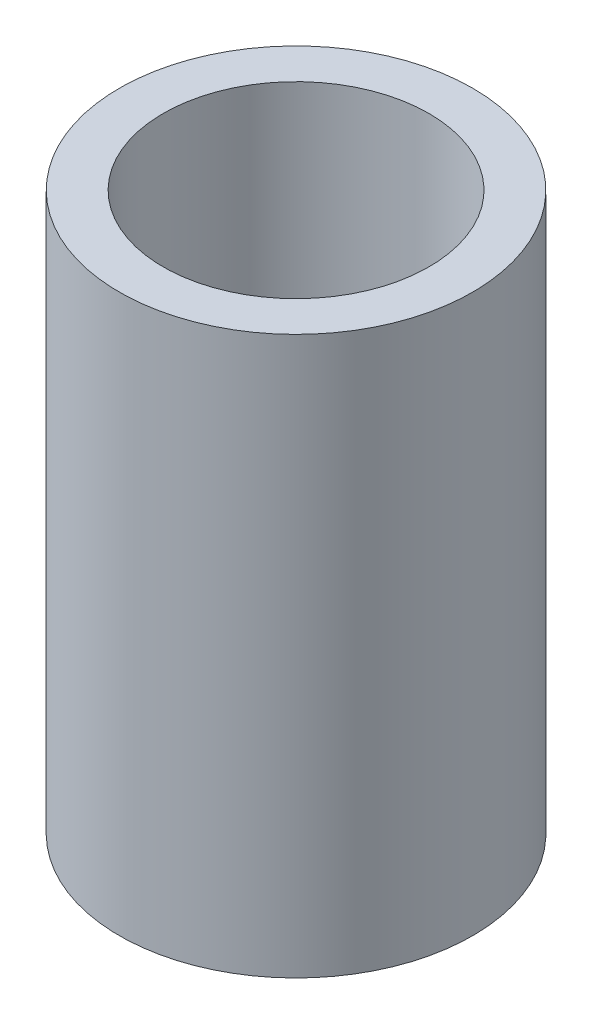
ISO-10303-21;
HEADER;
FILE_DESCRIPTION(('STEP AP214'),'2;1');
FILE_NAME('part.step','',(''),(''),'','','');
FILE_SCHEMA(('AUTOMOTIVE_DESIGN { 1 0 10303 214 1 1 1 1 }'));
ENDSEC;
DATA;
#1=APPLICATION_CONTEXT('core data for automotive mechanical design processes');
#2=APPLICATION_PROTOCOL_DEFINITION('international standard','automotive_design',2000,#1);
#3=PRODUCT_CONTEXT('',#1,'mechanical');
#4=PRODUCT('Part','Part','',(#3));
#5=PRODUCT_RELATED_PRODUCT_CATEGORY('part','',(#4));
#6=PRODUCT_DEFINITION_FORMATION('','',#4);
#7=PRODUCT_DEFINITION_CONTEXT('part definition',#1,'design');
#8=PRODUCT_DEFINITION('design','',#6,#7);
#9=PRODUCT_DEFINITION_SHAPE('','',#8);
#10=(LENGTH_UNIT() NAMED_UNIT(*) SI_UNIT(.MILLI.,.METRE.));
#11=(NAMED_UNIT(*) PLANE_ANGLE_UNIT() SI_UNIT($,.RADIAN.));
#12=(NAMED_UNIT(*) SI_UNIT($,.STERADIAN.) SOLID_ANGLE_UNIT());
#13=UNCERTAINTY_MEASURE_WITH_UNIT(LENGTH_MEASURE(1.E-05),#10,'distance_accuracy_value','');
#14=(GEOMETRIC_REPRESENTATION_CONTEXT(3) GLOBAL_UNCERTAINTY_ASSIGNED_CONTEXT((#13)) GLOBAL_UNIT_ASSIGNED_CONTEXT((#10,
#11,#12)) REPRESENTATION_CONTEXT('',''));
#15=CARTESIAN_POINT('',(0.,0.,0.));
#16=DIRECTION('',(0.,0.,1.));
#17=DIRECTION('',(1.,0.,0.));
#18=AXIS2_PLACEMENT_3D('',#15,#16,#17);
#19=CARTESIAN_POINT('',(0.,121.92,0.));
#20=DIRECTION('',(0.,-1.,0.));
#21=DIRECTION('',(0.,0.,-1.));
#22=AXIS2_PLACEMENT_3D('',#19,#20,#21);
#23=CYLINDRICAL_SURFACE('',#22,52.323742116433);
#24=CARTESIAN_POINT('',(0.,121.92,0.));
#25=DIRECTION('',(0.,1.,0.));
#26=DIRECTION('',(0.,0.,1.));
#27=AXIS2_PLACEMENT_3D('',#24,#25,#26);
#28=CIRCLE('',#27,52.323742116433);
#29=CARTESIAN_POINT('',(0.,121.92,-52.323742116433));
#30=VERTEX_POINT('',#29);
#31=EDGE_CURVE('E10',#30,#30,#28,.T.);
#32=CARTESIAN_POINT('',(0.,-43.18,0.));
#33=DIRECTION('',(0.,1.,0.));
#34=DIRECTION('',(0.,0.,1.));
#35=AXIS2_PLACEMENT_3D('',#32,#33,#34);
#36=CIRCLE('',#35,52.323742116433);
#37=CARTESIAN_POINT('',(0.,-43.18,-52.323742116433));
#38=VERTEX_POINT('',#37);
#39=EDGE_CURVE('E38',#38,#38,#36,.T.);
#40=CARTESIAN_POINT('',(0.,121.92,-52.323742116433));
#41=CARTESIAN_POINT('',(0.,120.200208333333,-52.323742116433));
#42=CARTESIAN_POINT('',(0.,118.480416666667,-52.323742116433));
#43=CARTESIAN_POINT('',(0.,115.040833333333,-52.323742116433));
#44=CARTESIAN_POINT('',(0.,113.321041666667,-52.323742116433));
#45=CARTESIAN_POINT('',(0.,109.881458333333,-52.323742116433));
#46=CARTESIAN_POINT('',(0.,108.161666666667,-52.323742116433));
#47=CARTESIAN_POINT('',(0.,104.722083333333,-52.323742116433));
#48=CARTESIAN_POINT('',(0.,103.002291666667,-52.323742116433));
#49=CARTESIAN_POINT('',(0.,99.5627083333333,-52.323742116433));
#50=CARTESIAN_POINT('',(0.,97.8429166666667,-52.323742116433));
#51=CARTESIAN_POINT('',(0.,94.4033333333333,-52.323742116433));
#52=CARTESIAN_POINT('',(0.,92.6835416666667,-52.323742116433));
#53=CARTESIAN_POINT('',(0.,89.2439583333333,-52.323742116433));
#54=CARTESIAN_POINT('',(0.,87.5241666666667,-52.323742116433));
#55=CARTESIAN_POINT('',(0.,84.0845833333333,-52.323742116433));
#56=CARTESIAN_POINT('',(0.,82.3647916666667,-52.323742116433));
#57=CARTESIAN_POINT('',(0.,78.9252083333333,-52.323742116433));
#58=CARTESIAN_POINT('',(0.,77.2054166666667,-52.323742116433));
#59=CARTESIAN_POINT('',(0.,73.7658333333333,-52.323742116433));
#60=CARTESIAN_POINT('',(0.,72.0460416666667,-52.323742116433));
#61=CARTESIAN_POINT('',(0.,68.6064583333333,-52.323742116433));
#62=CARTESIAN_POINT('',(0.,66.8866666666667,-52.323742116433));
#63=CARTESIAN_POINT('',(0.,63.4470833333333,-52.323742116433));
#64=CARTESIAN_POINT('',(0.,61.7272916666667,-52.323742116433));
#65=CARTESIAN_POINT('',(0.,58.2877083333333,-52.323742116433));
#66=CARTESIAN_POINT('',(0.,56.5679166666667,-52.323742116433));
#67=CARTESIAN_POINT('',(0.,53.1283333333333,-52.323742116433));
#68=CARTESIAN_POINT('',(0.,51.4085416666667,-52.323742116433));
#69=CARTESIAN_POINT('',(0.,47.9689583333333,-52.323742116433));
#70=CARTESIAN_POINT('',(0.,46.2491666666667,-52.323742116433));
#71=CARTESIAN_POINT('',(0.,42.8095833333333,-52.323742116433));
#72=CARTESIAN_POINT('',(0.,41.0897916666667,-52.323742116433));
#73=CARTESIAN_POINT('',(0.,37.6502083333333,-52.323742116433));
#74=CARTESIAN_POINT('',(0.,35.9304166666667,-52.323742116433));
#75=CARTESIAN_POINT('',(0.,32.4908333333333,-52.323742116433));
#76=CARTESIAN_POINT('',(0.,30.7710416666667,-52.323742116433));
#77=CARTESIAN_POINT('',(0.,27.3314583333333,-52.323742116433));
#78=CARTESIAN_POINT('',(0.,25.6116666666666,-52.323742116433));
#79=CARTESIAN_POINT('',(0.,22.1720833333333,-52.323742116433));
#80=CARTESIAN_POINT('',(0.,20.4522916666666,-52.323742116433));
#81=CARTESIAN_POINT('',(0.,17.0127083333333,-52.323742116433));
#82=CARTESIAN_POINT('',(0.,15.2929166666666,-52.323742116433));
#83=CARTESIAN_POINT('',(0.,11.8533333333333,-52.323742116433));
#84=CARTESIAN_POINT('',(0.,10.1335416666666,-52.323742116433));
#85=CARTESIAN_POINT('',(0.,6.69395833333331,-52.323742116433));
#86=CARTESIAN_POINT('',(0.,4.97416666666664,-52.323742116433));
#87=CARTESIAN_POINT('',(0.,1.53458333333331,-52.323742116433));
#88=CARTESIAN_POINT('',(0.,-0.185208333333363,-52.323742116433));
#89=CARTESIAN_POINT('',(0.,-3.6247916666667,-52.323742116433));
#90=CARTESIAN_POINT('',(0.,-5.34458333333336,-52.323742116433));
#91=CARTESIAN_POINT('',(0.,-8.78416666666669,-52.323742116433));
#92=CARTESIAN_POINT('',(0.,-10.5039583333334,-52.323742116433));
#93=CARTESIAN_POINT('',(0.,-13.9435416666667,-52.323742116433));
#94=CARTESIAN_POINT('',(0.,-15.6633333333333,-52.323742116433));
#95=CARTESIAN_POINT('',(0.,-19.1029166666667,-52.323742116433));
#96=CARTESIAN_POINT('',(0.,-20.8227083333334,-52.323742116433));
#97=CARTESIAN_POINT('',(0.,-24.2622916666667,-52.323742116433));
#98=CARTESIAN_POINT('',(0.,-25.9820833333334,-52.323742116433));
#99=CARTESIAN_POINT('',(0.,-29.4216666666667,-52.323742116433));
#100=CARTESIAN_POINT('',(0.,-31.1414583333334,-52.323742116433));
#101=CARTESIAN_POINT('',(0.,-34.5810416666667,-52.323742116433));
#102=CARTESIAN_POINT('',(0.,-36.3008333333334,-52.323742116433));
#103=CARTESIAN_POINT('',(0.,-39.7404166666667,-52.323742116433));
#104=CARTESIAN_POINT('',(0.,-41.4602083333334,-52.323742116433));
#105=CARTESIAN_POINT('',(0.,-43.18,-52.323742116433));
#106=B_SPLINE_CURVE_WITH_KNOTS('',3,(#40,#41,#42,#43,#44,#45,#46,#47,#48,#49,#50,#51,#52,#53,
#54,#55,#56,#57,#58,#59,#60,#61,#62,#63,#64,#65,#66,#67,#68,#69,#70,#71,#72,#73,#74,#75,#76,#77,
#78,#79,#80,#81,#82,#83,#84,#85,#86,#87,#88,#89,#90,#91,#92,#93,#94,#95,#96,#97,#98,#99,#100,
#101,#102,#103,#104,#105),.UNSPECIFIED.,.F.,.F.,(4,2,2,2,2,2,2,2,2,2,2,2,2,2,2,2,2,2,2,2,2,2,2,
2,2,2,2,2,2,2,2,2,4),(0.,5.15937500000001,10.31875,15.478125,20.6375,25.796875,30.95625,
36.115625,41.275,46.434375,51.59375,56.753125,61.9125,67.071875,72.23125,77.390625,82.55,
87.709375,92.86875,98.028125,103.1875,108.346875,113.50625,118.665625,123.825,128.984375,
134.14375,139.303125,144.4625,149.621875,154.78125,159.940625,165.1),.UNSPECIFIED.);
#107=EDGE_CURVE('BSEAM31',#30,#38,#106,.T.);
#108=ORIENTED_EDGE('',*,*,#31,.F.);
#109=ORIENTED_EDGE('',*,*,#39,.T.);
#110=ORIENTED_EDGE('',*,*,#107,.T.);
#111=ORIENTED_EDGE('',*,*,#107,.F.);
#112=EDGE_LOOP('',(#108,#110,#109,#111));
#113=FACE_BOUND('',#112,.T.);
#114=ADVANCED_FACE('F31',(#113),#23,.T.);
#115=CARTESIAN_POINT('',(0.,121.92,0.));
#116=DIRECTION('',(0.,1.,0.));
#117=DIRECTION('',(0.,0.,1.));
#118=AXIS2_PLACEMENT_3D('',#115,#116,#117);
#119=PLANE('',#118);
#120=CARTESIAN_POINT('',(0.,121.92,0.));
#121=DIRECTION('',(0.,1.,0.));
#122=DIRECTION('',(0.,0.,1.));
#123=AXIS2_PLACEMENT_3D('',#120,#121,#122);
#124=CIRCLE('',#123,39.369742116433);
#125=CARTESIAN_POINT('',(0.,121.92,-39.369742116433));
#126=VERTEX_POINT('',#125);
#127=EDGE_CURVE('E42',#126,#126,#124,.T.);
#128=ORIENTED_EDGE('',*,*,#127,.F.);
#129=EDGE_LOOP('',(#128));
#130=FACE_BOUND('',#129,.T.);
#131=ORIENTED_EDGE('',*,*,#31,.T.);
#132=EDGE_LOOP('',(#131));
#133=FACE_BOUND('',#132,.T.);
#134=ADVANCED_FACE('F63',(#130,#133),#119,.T.);
#135=CARTESIAN_POINT('',(0.,-43.18,0.));
#136=DIRECTION('',(0.,1.,0.));
#137=DIRECTION('',(0.,0.,1.));
#138=AXIS2_PLACEMENT_3D('',#135,#136,#137);
#139=PLANE('',#138);
#140=ORIENTED_EDGE('',*,*,#39,.F.);
#141=EDGE_LOOP('',(#140));
#142=FACE_BOUND('',#141,.T.);
#143=ADVANCED_FACE('F33',(#142),#139,.F.);
#144=CARTESIAN_POINT('',(0.,121.92,0.));
#145=DIRECTION('',(0.,-1.,0.));
#146=DIRECTION('',(0.,0.,-1.));
#147=AXIS2_PLACEMENT_3D('',#144,#145,#146);
#148=CYLINDRICAL_SURFACE('',#147,39.369742116433);
#149=CARTESIAN_POINT('',(0.,0.,0.));
#150=DIRECTION('',(0.,1.,0.));
#151=DIRECTION('',(0.,0.,1.));
#152=AXIS2_PLACEMENT_3D('',#149,#150,#151);
#153=CIRCLE('',#152,39.369742116433);
#154=CARTESIAN_POINT('',(0.,0.,-39.369742116433));
#155=VERTEX_POINT('',#154);
#156=EDGE_CURVE('E46',#155,#155,#153,.T.);
#157=CARTESIAN_POINT('',(0.,121.92,-39.369742116433));
#158=CARTESIAN_POINT('',(0.,120.65,-39.369742116433));
#159=CARTESIAN_POINT('',(0.,119.38,-39.369742116433));
#160=CARTESIAN_POINT('',(0.,116.84,-39.369742116433));
#161=CARTESIAN_POINT('',(0.,115.57,-39.369742116433));
#162=CARTESIAN_POINT('',(0.,113.03,-39.369742116433));
#163=CARTESIAN_POINT('',(0.,111.76,-39.369742116433));
#164=CARTESIAN_POINT('',(0.,109.22,-39.369742116433));
#165=CARTESIAN_POINT('',(0.,107.95,-39.369742116433));
#166=CARTESIAN_POINT('',(0.,105.41,-39.369742116433));
#167=CARTESIAN_POINT('',(0.,104.14,-39.369742116433));
#168=CARTESIAN_POINT('',(0.,101.6,-39.369742116433));
#169=CARTESIAN_POINT('',(0.,100.33,-39.369742116433));
#170=CARTESIAN_POINT('',(0.,97.79,-39.369742116433));
#171=CARTESIAN_POINT('',(0.,96.52,-39.369742116433));
#172=CARTESIAN_POINT('',(0.,93.98,-39.369742116433));
#173=CARTESIAN_POINT('',(0.,92.71,-39.369742116433));
#174=CARTESIAN_POINT('',(0.,90.17,-39.369742116433));
#175=CARTESIAN_POINT('',(0.,88.9,-39.369742116433));
#176=CARTESIAN_POINT('',(0.,86.36,-39.369742116433));
#177=CARTESIAN_POINT('',(0.,85.09,-39.369742116433));
#178=CARTESIAN_POINT('',(0.,82.55,-39.369742116433));
#179=CARTESIAN_POINT('',(0.,81.28,-39.369742116433));
#180=CARTESIAN_POINT('',(0.,78.74,-39.369742116433));
#181=CARTESIAN_POINT('',(0.,77.47,-39.369742116433));
#182=CARTESIAN_POINT('',(0.,74.93,-39.369742116433));
#183=CARTESIAN_POINT('',(0.,73.66,-39.369742116433));
#184=CARTESIAN_POINT('',(0.,71.12,-39.369742116433));
#185=CARTESIAN_POINT('',(0.,69.85,-39.369742116433));
#186=CARTESIAN_POINT('',(0.,67.31,-39.369742116433));
#187=CARTESIAN_POINT('',(0.,66.04,-39.369742116433));
#188=CARTESIAN_POINT('',(0.,63.5,-39.369742116433));
#189=CARTESIAN_POINT('',(0.,62.23,-39.369742116433));
#190=CARTESIAN_POINT('',(0.,59.69,-39.369742116433));
#191=CARTESIAN_POINT('',(0.,58.42,-39.369742116433));
#192=CARTESIAN_POINT('',(0.,55.88,-39.369742116433));
#193=CARTESIAN_POINT('',(0.,54.61,-39.369742116433));
#194=CARTESIAN_POINT('',(0.,52.07,-39.369742116433));
#195=CARTESIAN_POINT('',(0.,50.8,-39.369742116433));
#196=CARTESIAN_POINT('',(0.,48.26,-39.369742116433));
#197=CARTESIAN_POINT('',(0.,46.99,-39.369742116433));
#198=CARTESIAN_POINT('',(0.,44.45,-39.369742116433));
#199=CARTESIAN_POINT('',(0.,43.18,-39.369742116433));
#200=CARTESIAN_POINT('',(0.,40.64,-39.369742116433));
#201=CARTESIAN_POINT('',(0.,39.37,-39.369742116433));
#202=CARTESIAN_POINT('',(0.,36.83,-39.369742116433));
#203=CARTESIAN_POINT('',(0.,35.56,-39.369742116433));
#204=CARTESIAN_POINT('',(0.,33.02,-39.369742116433));
#205=CARTESIAN_POINT('',(0.,31.75,-39.369742116433));
#206=CARTESIAN_POINT('',(0.,29.21,-39.369742116433));
#207=CARTESIAN_POINT('',(0.,27.94,-39.369742116433));
#208=CARTESIAN_POINT('',(0.,25.4,-39.369742116433));
#209=CARTESIAN_POINT('',(0.,24.13,-39.369742116433));
#210=CARTESIAN_POINT('',(0.,21.59,-39.369742116433));
#211=CARTESIAN_POINT('',(0.,20.32,-39.369742116433));
#212=CARTESIAN_POINT('',(0.,17.78,-39.369742116433));
#213=CARTESIAN_POINT('',(0.,16.51,-39.369742116433));
#214=CARTESIAN_POINT('',(0.,13.97,-39.369742116433));
#215=CARTESIAN_POINT('',(0.,12.7,-39.369742116433));
#216=CARTESIAN_POINT('',(0.,10.16,-39.369742116433));
#217=CARTESIAN_POINT('',(0.,8.89,-39.369742116433));
#218=CARTESIAN_POINT('',(0.,6.35,-39.369742116433));
#219=CARTESIAN_POINT('',(0.,5.08000000000001,-39.369742116433));
#220=CARTESIAN_POINT('',(0.,2.54,-39.369742116433));
#221=CARTESIAN_POINT('',(0.,1.27,-39.369742116433));
#222=CARTESIAN_POINT('',(0.,0.,-39.369742116433));
#223=B_SPLINE_CURVE_WITH_KNOTS('',3,(#157,#158,#159,#160,#161,#162,#163,#164,#165,#166,#167,
#168,#169,#170,#171,#172,#173,#174,#175,#176,#177,#178,#179,#180,#181,#182,#183,#184,#185,#186,
#187,#188,#189,#190,#191,#192,#193,#194,#195,#196,#197,#198,#199,#200,#201,#202,#203,#204,#205,
#206,#207,#208,#209,#210,#211,#212,#213,#214,#215,#216,#217,#218,#219,#220,#221,#222),
.UNSPECIFIED.,.F.,.F.,(4,2,2,2,2,2,2,2,2,2,2,2,2,2,2,2,2,2,2,2,2,2,2,2,2,2,2,2,2,2,2,2,4),(0.,
3.81000000000001,7.62,11.43,15.24,19.05,22.86,26.67,30.48,34.29,38.1,41.91,45.72,49.53,53.34,
57.15,60.96,64.77,68.58,72.39,76.2,80.01,83.82,87.63,91.44,95.25,99.06,102.87,106.68,110.49,
114.3,118.11,121.92),.UNSPECIFIED.);
#224=EDGE_CURVE('BSEAM54',#126,#155,#223,.T.);
#225=ORIENTED_EDGE('',*,*,#127,.T.);
#226=ORIENTED_EDGE('',*,*,#156,.F.);
#227=ORIENTED_EDGE('',*,*,#224,.T.);
#228=ORIENTED_EDGE('',*,*,#224,.F.);
#229=EDGE_LOOP('',(#225,#227,#226,#228));
#230=FACE_BOUND('',#229,.T.);
#231=ADVANCED_FACE('F54',(#230),#148,.F.);
#232=CARTESIAN_POINT('',(0.,0.,0.));
#233=DIRECTION('',(0.,1.,0.));
#234=DIRECTION('',(0.,0.,1.));
#235=AXIS2_PLACEMENT_3D('',#232,#233,#234);
#236=PLANE('',#235);
#237=ORIENTED_EDGE('',*,*,#156,.T.);
#238=EDGE_LOOP('',(#237));
#239=FACE_BOUND('',#238,.T.);
#240=ADVANCED_FACE('F52',(#239),#236,.T.);
#241=CLOSED_SHELL('',(#114,#134,#143,#231,#240));
#242=MANIFOLD_SOLID_BREP('B2',#241);
#243=ADVANCED_BREP_SHAPE_REPRESENTATION('',(#18,#242),#14);
#244=SHAPE_DEFINITION_REPRESENTATION(#9,#243);
ENDSEC;
END-ISO-10303-21;
